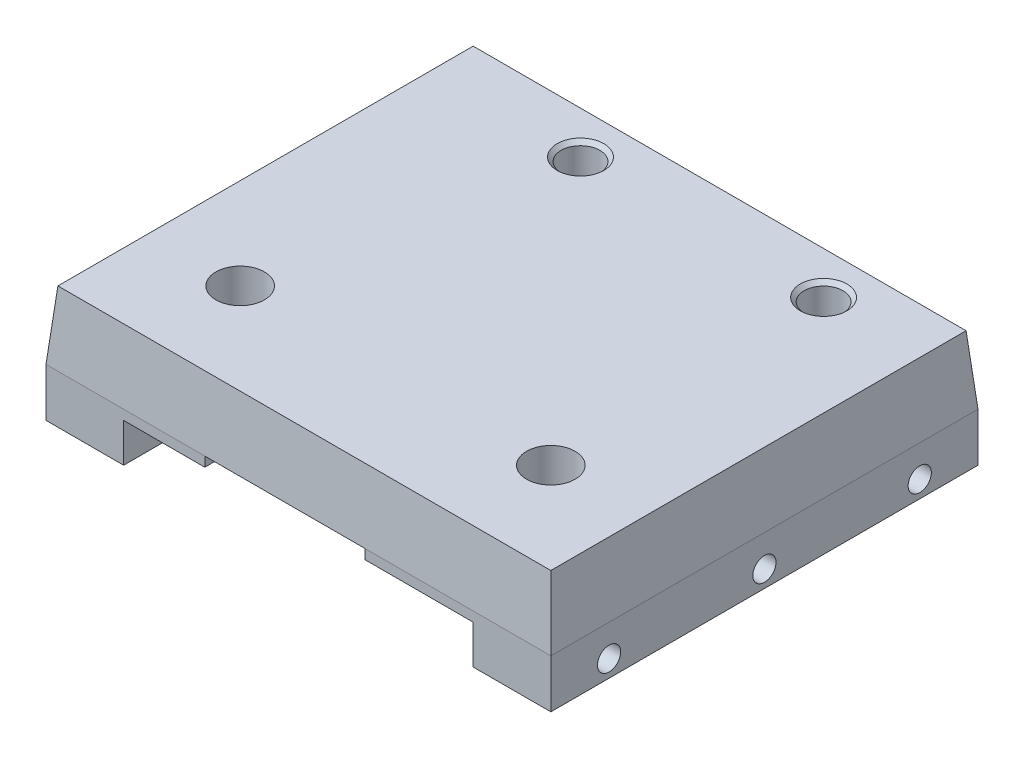
ISO-10303-21;
HEADER;
FILE_DESCRIPTION(('STEP AP214'),'2;1');
FILE_NAME('part.step','',(''),(''),'','','');
FILE_SCHEMA(('AUTOMOTIVE_DESIGN { 1 0 10303 214 1 1 1 1 }'));
ENDSEC;
DATA;
#1=APPLICATION_CONTEXT('core data for automotive mechanical design processes');
#2=APPLICATION_PROTOCOL_DEFINITION('international standard','automotive_design',2000,#1);
#3=PRODUCT_CONTEXT('',#1,'mechanical');
#4=PRODUCT('Part','Part','',(#3));
#5=PRODUCT_RELATED_PRODUCT_CATEGORY('part','',(#4));
#6=PRODUCT_DEFINITION_FORMATION('','',#4);
#7=PRODUCT_DEFINITION_CONTEXT('part definition',#1,'design');
#8=PRODUCT_DEFINITION('design','',#6,#7);
#9=PRODUCT_DEFINITION_SHAPE('','',#8);
#10=(LENGTH_UNIT() NAMED_UNIT(*) SI_UNIT(.MILLI.,.METRE.));
#11=(NAMED_UNIT(*) PLANE_ANGLE_UNIT() SI_UNIT($,.RADIAN.));
#12=(NAMED_UNIT(*) SI_UNIT($,.STERADIAN.) SOLID_ANGLE_UNIT());
#13=UNCERTAINTY_MEASURE_WITH_UNIT(LENGTH_MEASURE(1.E-05),#10,'distance_accuracy_value','');
#14=(GEOMETRIC_REPRESENTATION_CONTEXT(3) GLOBAL_UNCERTAINTY_ASSIGNED_CONTEXT((#13)) GLOBAL_UNIT_ASSIGNED_CONTEXT((#10,
#11,#12)) REPRESENTATION_CONTEXT('',''));
#15=CARTESIAN_POINT('',(0.,0.,0.));
#16=DIRECTION('',(0.,0.,1.));
#17=DIRECTION('',(1.,0.,0.));
#18=AXIS2_PLACEMENT_3D('',#15,#16,#17);
#19=CARTESIAN_POINT('',(0.,0.,0.));
#20=DIRECTION('',(0.,1.,0.));
#21=DIRECTION('',(0.,0.,1.));
#22=AXIS2_PLACEMENT_3D('',#19,#20,#21);
#23=PLANE('',#22);
#24=DIRECTION('',(0.,0.,-1.));
#25=VECTOR('',#24,1.);
#26=CARTESIAN_POINT('',(10.8908903883744,0.,34.925));
#27=LINE('',#26,#25);
#28=CARTESIAN_POINT('',(10.8908903883744,0.,34.925));
#29=VERTEX_POINT('',#28);
#30=CARTESIAN_POINT('',(10.8908903883744,0.,-34.925));
#31=VERTEX_POINT('',#30);
#32=EDGE_CURVE('E144',#29,#31,#27,.T.);
#33=ORIENTED_EDGE('',*,*,#32,.F.);
#34=DIRECTION('',(-1.,0.,0.));
#35=VECTOR('',#34,1.);
#36=CARTESIAN_POINT('',(0.,0.,34.925));
#37=LINE('',#36,#35);
#38=CARTESIAN_POINT('',(-15.3077386639732,0.,34.925));
#39=VERTEX_POINT('',#38);
#40=EDGE_CURVE('E100',#29,#39,#37,.T.);
#41=ORIENTED_EDGE('',*,*,#40,.T.);
#42=DIRECTION('',(0.,0.,1.));
#43=VECTOR('',#42,1.);
#44=CARTESIAN_POINT('',(-15.3077386639732,0.,34.925));
#45=LINE('',#44,#43);
#46=CARTESIAN_POINT('',(-15.3077386639732,0.,-34.925));
#47=VERTEX_POINT('',#46);
#48=EDGE_CURVE('E142',#47,#39,#45,.T.);
#49=ORIENTED_EDGE('',*,*,#48,.F.);
#50=DIRECTION('',(1.,0.,0.));
#51=VECTOR('',#50,1.);
#52=CARTESIAN_POINT('',(0.,0.,-34.925));
#53=LINE('',#52,#51);
#54=EDGE_CURVE('E124',#31,#47,#53,.F.);
#55=ORIENTED_EDGE('',*,*,#54,.F.);
#56=EDGE_LOOP('',(#33,#41,#49,#55));
#57=FACE_BOUND('',#56,.T.);
#58=ADVANCED_FACE('F39',(#57),#23,.F.);
#59=CARTESIAN_POINT('',(28.575,-7.9375,34.925));
#60=DIRECTION('',(1.,0.,0.));
#61=DIRECTION('',(0.,0.,-1.));
#62=AXIS2_PLACEMENT_3D('',#59,#60,#61);
#63=PLANE('',#62);
#64=CARTESIAN_POINT('',(28.575,-5.151627132439,25.4));
#65=DIRECTION('',(1.,0.,0.));
#66=DIRECTION('',(0.,0.,-1.));
#67=AXIS2_PLACEMENT_3D('',#64,#65,#66);
#68=CIRCLE('',#67,1.89864999999999);
#69=CARTESIAN_POINT('',(28.575,-5.151627132439,23.50135));
#70=VERTEX_POINT('',#69);
#71=EDGE_CURVE('E733',#70,#70,#68,.T.);
#72=ORIENTED_EDGE('',*,*,#71,.T.);
#73=EDGE_LOOP('',(#72));
#74=FACE_BOUND('',#73,.T.);
#75=CARTESIAN_POINT('',(28.575,-5.151627132439,-25.4));
#76=DIRECTION('',(1.,0.,0.));
#77=DIRECTION('',(0.,0.,-1.));
#78=AXIS2_PLACEMENT_3D('',#75,#76,#77);
#79=CIRCLE('',#78,1.89864999999999);
#80=CARTESIAN_POINT('',(28.575,-5.151627132439,-27.29865));
#81=VERTEX_POINT('',#80);
#82=EDGE_CURVE('E739',#81,#81,#79,.T.);
#83=ORIENTED_EDGE('',*,*,#82,.T.);
#84=EDGE_LOOP('',(#83));
#85=FACE_BOUND('',#84,.T.);
#86=CARTESIAN_POINT('',(28.575,-5.151627132439,0.));
#87=DIRECTION('',(1.,0.,0.));
#88=DIRECTION('',(0.,0.,-1.));
#89=AXIS2_PLACEMENT_3D('',#86,#87,#88);
#90=CIRCLE('',#89,1.89864999999999);
#91=CARTESIAN_POINT('',(28.575,-5.151627132439,-1.89865));
#92=VERTEX_POINT('',#91);
#93=EDGE_CURVE('E745',#92,#92,#90,.T.);
#94=ORIENTED_EDGE('',*,*,#93,.T.);
#95=EDGE_LOOP('',(#94));
#96=FACE_BOUND('',#95,.T.);
#97=DIRECTION('',(0.,0.,1.));
#98=VECTOR('',#97,1.);
#99=CARTESIAN_POINT('',(28.575,-1.5875,34.925));
#100=LINE('',#99,#98);
#101=CARTESIAN_POINT('',(28.575,-1.5875,-34.925));
#102=VERTEX_POINT('',#101);
#103=CARTESIAN_POINT('',(28.575,-1.5875,34.925));
#104=VERTEX_POINT('',#103);
#105=EDGE_CURVE('E748',#102,#104,#100,.T.);
#106=ORIENTED_EDGE('',*,*,#105,.F.);
#107=DIRECTION('',(0.,1.,0.));
#108=VECTOR('',#107,1.);
#109=CARTESIAN_POINT('',(28.575,-7.9375,-34.925));
#110=LINE('',#109,#108);
#111=CARTESIAN_POINT('',(28.575,-7.9375,-34.925));
#112=VERTEX_POINT('',#111);
#113=EDGE_CURVE('E194',#112,#102,#110,.T.);
#114=ORIENTED_EDGE('',*,*,#113,.F.);
#115=DIRECTION('',(0.,0.,-1.));
#116=VECTOR('',#115,1.);
#117=CARTESIAN_POINT('',(28.575,-7.9375,34.925));
#118=LINE('',#117,#116);
#119=CARTESIAN_POINT('',(28.575,-7.9375,34.925));
#120=VERTEX_POINT('',#119);
#121=EDGE_CURVE('E185',#120,#112,#118,.T.);
#122=ORIENTED_EDGE('',*,*,#121,.F.);
#123=DIRECTION('',(0.,1.,0.));
#124=VECTOR('',#123,1.);
#125=CARTESIAN_POINT('',(28.575,-7.9375,34.925));
#126=LINE('',#125,#124);
#127=EDGE_CURVE('E197',#120,#104,#126,.T.);
#128=ORIENTED_EDGE('',*,*,#127,.T.);
#129=EDGE_LOOP('',(#106,#114,#122,#128));
#130=FACE_BOUND('',#129,.T.);
#131=ADVANCED_FACE('F248',(#74,#85,#96,#130),#63,.F.);
#132=CARTESIAN_POINT('',(-41.275,0.,0.));
#133=DIRECTION('',(-0.996194698091746,0.0871557427476582,0.));
#134=DIRECTION('',(-0.0871557427476582,-0.996194698091746,0.));
#135=AXIS2_PLACEMENT_3D('',#132,#133,#134);
#136=PLANE('',#135);
#137=DIRECTION('',(0.,0.,-1.));
#138=VECTOR('',#137,1.);
#139=CARTESIAN_POINT('',(-41.275,0.,0.));
#140=LINE('',#139,#138);
#141=CARTESIAN_POINT('',(-41.275,0.,34.925));
#142=VERTEX_POINT('',#141);
#143=CARTESIAN_POINT('',(-41.275,0.,-34.925));
#144=VERTEX_POINT('',#143);
#145=EDGE_CURVE('E97',#142,#144,#140,.T.);
#146=ORIENTED_EDGE('',*,*,#145,.F.);
#147=DIRECTION('',(-0.0868265938642476,-0.992432509138967,0.0868265938642477));
#148=VECTOR('',#147,1.);
#149=CARTESIAN_POINT('',(-40.9638336607297,3.55664753271849,34.6138336607297));
#150=LINE('',#149,#148);
#151=CARTESIAN_POINT('',(-40.3027822265682,11.1125,33.9527822265682));
#152=VERTEX_POINT('',#151);
#153=EDGE_CURVE('E11',#152,#142,#150,.T.);
#154=ORIENTED_EDGE('',*,*,#153,.F.);
#155=DIRECTION('',(0.,0.,1.));
#156=VECTOR('',#155,1.);
#157=CARTESIAN_POINT('',(-40.3027822265682,11.1125,0.));
#158=LINE('',#157,#156);
#159=CARTESIAN_POINT('',(-40.3027822265682,11.1125,-33.9527822265682));
#160=VERTEX_POINT('',#159);
#161=EDGE_CURVE('E104',#160,#152,#158,.T.);
#162=ORIENTED_EDGE('',*,*,#161,.F.);
#163=DIRECTION('',(0.0868265938642476,0.992432509138967,0.0868265938642476));
#164=VECTOR('',#163,1.);
#165=CARTESIAN_POINT('',(-40.9638336607297,3.55664753271849,-34.6138336607297));
#166=LINE('',#165,#164);
#167=EDGE_CURVE('E87',#160,#144,#166,.F.);
#168=ORIENTED_EDGE('',*,*,#167,.T.);
#169=EDGE_LOOP('',(#146,#154,#162,#168));
#170=FACE_BOUND('',#169,.T.);
#171=ADVANCED_FACE('F252',(#170),#136,.T.);
#172=CARTESIAN_POINT('',(0.,0.,34.925));
#173=DIRECTION('',(0.,0.0871557427476582,0.996194698091746));
#174=DIRECTION('',(0.,-0.996194698091746,0.0871557427476582));
#175=AXIS2_PLACEMENT_3D('',#172,#173,#174);
#176=PLANE('',#175);
#177=CARTESIAN_POINT('',(41.275,0.,34.925));
#178=VERTEX_POINT('',#177);
#179=EDGE_CURVE('E125',#178,#29,#37,.T.);
#180=ORIENTED_EDGE('',*,*,#179,.F.);
#181=DIRECTION('',(-0.0868265938642476,0.992432509138967,-0.0868265938642476));
#182=VECTOR('',#181,1.);
#183=CARTESIAN_POINT('',(40.9638336607297,3.55664753271849,34.6138336607297));
#184=LINE('',#183,#182);
#185=CARTESIAN_POINT('',(40.3027822265682,11.1125,33.9527822265682));
#186=VERTEX_POINT('',#185);
#187=EDGE_CURVE('E49',#186,#178,#184,.F.);
#188=ORIENTED_EDGE('',*,*,#187,.F.);
#189=DIRECTION('',(1.,0.,0.));
#190=VECTOR('',#189,1.);
#191=CARTESIAN_POINT('',(0.,11.1125,33.9527822265682));
#192=LINE('',#191,#190);
#193=EDGE_CURVE('E95',#152,#186,#192,.T.);
#194=ORIENTED_EDGE('',*,*,#193,.F.);
#195=ORIENTED_EDGE('',*,*,#153,.T.);
#196=DIRECTION('',(-1.,0.,0.));
#197=VECTOR('',#196,1.);
#198=CARTESIAN_POINT('',(-41.275,0.,34.925));
#199=LINE('',#198,#197);
#200=EDGE_CURVE('E148',#39,#142,#199,.T.);
#201=ORIENTED_EDGE('',*,*,#200,.F.);
#202=ORIENTED_EDGE('',*,*,#40,.F.);
#203=EDGE_LOOP('',(#180,#188,#194,#195,#201,#202));
#204=FACE_BOUND('',#203,.T.);
#205=ADVANCED_FACE('F149',(#204),#176,.T.);
#206=CARTESIAN_POINT('',(41.275,0.,0.));
#207=DIRECTION('',(0.996194698091746,0.0871557427476582,0.));
#208=DIRECTION('',(-0.0871557427476582,0.996194698091746,0.));
#209=AXIS2_PLACEMENT_3D('',#206,#207,#208);
#210=PLANE('',#209);
#211=DIRECTION('',(0.,0.,1.));
#212=VECTOR('',#211,1.);
#213=CARTESIAN_POINT('',(41.275,0.,0.));
#214=LINE('',#213,#212);
#215=CARTESIAN_POINT('',(41.275,0.,-34.925));
#216=VERTEX_POINT('',#215);
#217=EDGE_CURVE('E84',#178,#216,#214,.F.);
#218=ORIENTED_EDGE('',*,*,#217,.T.);
#219=DIRECTION('',(0.0868265938642476,-0.992432509138967,-0.0868265938642477));
#220=VECTOR('',#219,1.);
#221=CARTESIAN_POINT('',(40.9638336607297,3.55664753271849,-34.6138336607297));
#222=LINE('',#221,#220);
#223=CARTESIAN_POINT('',(40.3027822265682,11.1125,-33.9527822265682));
#224=VERTEX_POINT('',#223);
#225=EDGE_CURVE('E80',#224,#216,#222,.T.);
#226=ORIENTED_EDGE('',*,*,#225,.F.);
#227=DIRECTION('',(0.,0.,1.));
#228=VECTOR('',#227,1.);
#229=CARTESIAN_POINT('',(40.3027822265682,11.1125,0.));
#230=LINE('',#229,#228);
#231=EDGE_CURVE('E43',#186,#224,#230,.F.);
#232=ORIENTED_EDGE('',*,*,#231,.F.);
#233=ORIENTED_EDGE('',*,*,#187,.T.);
#234=EDGE_LOOP('',(#218,#226,#232,#233));
#235=FACE_BOUND('',#234,.T.);
#236=ADVANCED_FACE('F41',(#235),#210,.T.);
#237=CARTESIAN_POINT('',(0.,0.,-34.925));
#238=DIRECTION('',(0.,0.0871557427476582,-0.996194698091746));
#239=DIRECTION('',(0.,0.996194698091746,0.0871557427476582));
#240=AXIS2_PLACEMENT_3D('',#237,#238,#239);
#241=PLANE('',#240);
#242=EDGE_CURVE('E120',#216,#31,#53,.F.);
#243=ORIENTED_EDGE('',*,*,#242,.T.);
#244=ORIENTED_EDGE('',*,*,#54,.T.);
#245=DIRECTION('',(1.,0.,0.));
#246=VECTOR('',#245,1.);
#247=CARTESIAN_POINT('',(-41.275,0.,-34.925));
#248=LINE('',#247,#246);
#249=EDGE_CURVE('E58',#144,#47,#248,.T.);
#250=ORIENTED_EDGE('',*,*,#249,.F.);
#251=ORIENTED_EDGE('',*,*,#167,.F.);
#252=DIRECTION('',(1.,0.,0.));
#253=VECTOR('',#252,1.);
#254=CARTESIAN_POINT('',(0.,11.1125,-33.9527822265682));
#255=LINE('',#254,#253);
#256=EDGE_CURVE('E93',#224,#160,#255,.F.);
#257=ORIENTED_EDGE('',*,*,#256,.F.);
#258=ORIENTED_EDGE('',*,*,#225,.T.);
#259=EDGE_LOOP('',(#243,#244,#250,#251,#257,#258));
#260=FACE_BOUND('',#259,.T.);
#261=ADVANCED_FACE('F96',(#260),#241,.T.);
#262=CARTESIAN_POINT('',(0.,11.1125,0.));
#263=DIRECTION('',(0.,-1.,0.));
#264=DIRECTION('',(0.,0.,-1.));
#265=AXIS2_PLACEMENT_3D('',#262,#263,#264);
#266=PLANE('',#265);
#267=CARTESIAN_POINT('',(-15.8177036850335,11.1125,-27.0183903920811));
#268=DIRECTION('',(0.,1.,0.));
#269=DIRECTION('',(0.,0.,1.));
#270=AXIS2_PLACEMENT_3D('',#267,#268,#269);
#271=CIRCLE('',#270,3.81);
#272=CARTESIAN_POINT('',(-15.8177036850335,11.1125,-23.2083903920811));
#273=VERTEX_POINT('',#272);
#274=EDGE_CURVE('E721',#273,#273,#271,.T.);
#275=ORIENTED_EDGE('',*,*,#274,.F.);
#276=EDGE_LOOP('',(#275));
#277=FACE_BOUND('',#276,.T.);
#278=CARTESIAN_POINT('',(23.9310882670804,11.1125,-27.0183903920814));
#279=DIRECTION('',(0.,1.,0.));
#280=DIRECTION('',(0.,0.,1.));
#281=AXIS2_PLACEMENT_3D('',#278,#279,#280);
#282=CIRCLE('',#281,3.81);
#283=CARTESIAN_POINT('',(23.9310882670804,11.1125,-23.2083903920814));
#284=VERTEX_POINT('',#283);
#285=EDGE_CURVE('E714',#284,#284,#282,.T.);
#286=ORIENTED_EDGE('',*,*,#285,.F.);
#287=EDGE_LOOP('',(#286));
#288=FACE_BOUND('',#287,.T.);
#289=CARTESIAN_POINT('',(-25.4,11.1125,19.05));
#290=DIRECTION('',(0.,1.,0.));
#291=DIRECTION('',(0.,0.,1.));
#292=AXIS2_PLACEMENT_3D('',#289,#290,#291);
#293=CIRCLE('',#292,3.96874999999999);
#294=CARTESIAN_POINT('',(-25.4,11.1125,23.01875));
#295=VERTEX_POINT('',#294);
#296=EDGE_CURVE('E224',#295,#295,#293,.T.);
#297=ORIENTED_EDGE('',*,*,#296,.F.);
#298=EDGE_LOOP('',(#297));
#299=FACE_BOUND('',#298,.T.);
#300=CARTESIAN_POINT('',(25.4,11.1125,19.05));
#301=DIRECTION('',(0.,1.,0.));
#302=DIRECTION('',(0.,0.,1.));
#303=AXIS2_PLACEMENT_3D('',#300,#301,#302);
#304=CIRCLE('',#303,3.96874999999999);
#305=CARTESIAN_POINT('',(25.4,11.1125,23.01875));
#306=VERTEX_POINT('',#305);
#307=EDGE_CURVE('E112',#306,#306,#304,.T.);
#308=ORIENTED_EDGE('',*,*,#307,.F.);
#309=EDGE_LOOP('',(#308));
#310=FACE_BOUND('',#309,.T.);
#311=ORIENTED_EDGE('',*,*,#161,.T.);
#312=ORIENTED_EDGE('',*,*,#193,.T.);
#313=ORIENTED_EDGE('',*,*,#231,.T.);
#314=ORIENTED_EDGE('',*,*,#256,.T.);
#315=EDGE_LOOP('',(#311,#312,#313,#314));
#316=FACE_BOUND('',#315,.T.);
#317=ADVANCED_FACE('F92',(#277,#288,#299,#310,#316),#266,.F.);
#318=CARTESIAN_POINT('',(25.4,1.5875,19.05));
#319=DIRECTION('',(0.,1.,0.));
#320=DIRECTION('',(0.,0.,1.));
#321=AXIS2_PLACEMENT_3D('',#318,#319,#320);
#322=CONICAL_SURFACE('',#321,3.96875,1.02974425867665);
#323=CARTESIAN_POINT('',(25.4,1.5875,19.05));
#324=DIRECTION('',(0.,1.,0.));
#325=DIRECTION('',(0.,0.,1.));
#326=AXIS2_PLACEMENT_3D('',#323,#324,#325);
#327=CIRCLE('',#326,3.96875);
#328=CARTESIAN_POINT('',(25.4,1.5875,23.01875));
#329=VERTEX_POINT('',#328);
#330=EDGE_CURVE('E107',#329,#329,#327,.T.);
#331=ORIENTED_EDGE('',*,*,#330,.T.);
#332=EDGE_LOOP('',(#331));
#333=FACE_BOUND('',#332,.T.);
#334=CARTESIAN_POINT('',(25.4,0.,19.05));
#335=DIRECTION('',(0.,1.,0.));
#336=DIRECTION('',(0.,0.,1.));
#337=AXIS2_PLACEMENT_3D('',#334,#335,#336);
#338=CIRCLE('',#337,1.32670632176855);
#339=CARTESIAN_POINT('',(25.4,0.,20.3767063217686));
#340=VERTEX_POINT('',#339);
#341=EDGE_CURVE('E105',#340,#340,#338,.T.);
#342=ORIENTED_EDGE('',*,*,#341,.F.);
#343=EDGE_LOOP('',(#342));
#344=FACE_BOUND('',#343,.T.);
#345=ADVANCED_FACE('F234',(#333,#344),#322,.F.);
#346=CARTESIAN_POINT('',(25.4,11.1125,19.05));
#347=DIRECTION('',(0.,1.,0.));
#348=DIRECTION('',(0.,0.,1.));
#349=AXIS2_PLACEMENT_3D('',#346,#347,#348);
#350=CYLINDRICAL_SURFACE('',#349,3.96874999999999);
#351=ORIENTED_EDGE('',*,*,#330,.F.);
#352=EDGE_LOOP('',(#351));
#353=FACE_BOUND('',#352,.T.);
#354=ORIENTED_EDGE('',*,*,#307,.T.);
#355=EDGE_LOOP('',(#354));
#356=FACE_BOUND('',#355,.T.);
#357=ADVANCED_FACE('F231',(#353,#356),#350,.F.);
#358=CARTESIAN_POINT('',(-25.4,1.5875,19.05));
#359=DIRECTION('',(0.,1.,0.));
#360=DIRECTION('',(0.,0.,1.));
#361=AXIS2_PLACEMENT_3D('',#358,#359,#360);
#362=CONICAL_SURFACE('',#361,3.96875,1.02974425867665);
#363=CARTESIAN_POINT('',(-25.4,1.5875,19.05));
#364=DIRECTION('',(0.,1.,0.));
#365=DIRECTION('',(0.,0.,1.));
#366=AXIS2_PLACEMENT_3D('',#363,#364,#365);
#367=CIRCLE('',#366,3.96875);
#368=CARTESIAN_POINT('',(-25.4,1.5875,23.01875));
#369=VERTEX_POINT('',#368);
#370=EDGE_CURVE('E119',#369,#369,#367,.T.);
#371=ORIENTED_EDGE('',*,*,#370,.T.);
#372=EDGE_LOOP('',(#371));
#373=FACE_BOUND('',#372,.T.);
#374=CARTESIAN_POINT('',(-25.4,0.,19.05));
#375=DIRECTION('',(0.,1.,0.));
#376=DIRECTION('',(0.,0.,1.));
#377=AXIS2_PLACEMENT_3D('',#374,#375,#376);
#378=CIRCLE('',#377,1.32670632176855);
#379=CARTESIAN_POINT('',(-25.4,0.,20.3767063217686));
#380=VERTEX_POINT('',#379);
#381=EDGE_CURVE('E116',#380,#380,#378,.T.);
#382=ORIENTED_EDGE('',*,*,#381,.F.);
#383=EDGE_LOOP('',(#382));
#384=FACE_BOUND('',#383,.T.);
#385=ADVANCED_FACE('F528',(#373,#384),#362,.F.);
#386=CARTESIAN_POINT('',(-25.4,11.1125,19.05));
#387=DIRECTION('',(0.,1.,0.));
#388=DIRECTION('',(0.,0.,1.));
#389=AXIS2_PLACEMENT_3D('',#386,#387,#388);
#390=CYLINDRICAL_SURFACE('',#389,3.96874999999999);
#391=ORIENTED_EDGE('',*,*,#370,.F.);
#392=EDGE_LOOP('',(#391));
#393=FACE_BOUND('',#392,.T.);
#394=ORIENTED_EDGE('',*,*,#296,.T.);
#395=EDGE_LOOP('',(#394));
#396=FACE_BOUND('',#395,.T.);
#397=ADVANCED_FACE('F524',(#393,#396),#390,.F.);
#398=CARTESIAN_POINT('',(-41.275,-7.9375,-34.925));
#399=DIRECTION('',(1.,0.,0.));
#400=DIRECTION('',(0.,0.,-1.));
#401=AXIS2_PLACEMENT_3D('',#398,#399,#400);
#402=PLANE('',#401);
#403=ORIENTED_EDGE('',*,*,#145,.T.);
#404=DIRECTION('',(0.,1.,0.));
#405=VECTOR('',#404,1.);
#406=CARTESIAN_POINT('',(-41.275,-7.9375,-34.925));
#407=LINE('',#406,#405);
#408=CARTESIAN_POINT('',(-41.275,-7.9375,-34.925));
#409=VERTEX_POINT('',#408);
#410=EDGE_CURVE('E221',#409,#144,#407,.T.);
#411=ORIENTED_EDGE('',*,*,#410,.F.);
#412=DIRECTION('',(0.,0.,-1.));
#413=VECTOR('',#412,1.);
#414=CARTESIAN_POINT('',(-41.275,-7.9375,-34.925));
#415=LINE('',#414,#413);
#416=CARTESIAN_POINT('',(-41.275,-7.9375,34.925));
#417=VERTEX_POINT('',#416);
#418=EDGE_CURVE('E155',#417,#409,#415,.T.);
#419=ORIENTED_EDGE('',*,*,#418,.F.);
#420=DIRECTION('',(0.,1.,0.));
#421=VECTOR('',#420,1.);
#422=CARTESIAN_POINT('',(-41.275,-7.9375,34.925));
#423=LINE('',#422,#421);
#424=EDGE_CURVE('E213',#417,#142,#423,.T.);
#425=ORIENTED_EDGE('',*,*,#424,.T.);
#426=EDGE_LOOP('',(#403,#411,#419,#425));
#427=FACE_BOUND('',#426,.T.);
#428=ADVANCED_FACE('F286',(#427),#402,.F.);
#429=CARTESIAN_POINT('',(-41.275,-7.9375,-34.925));
#430=DIRECTION('',(0.,0.,1.));
#431=DIRECTION('',(1.,0.,0.));
#432=AXIS2_PLACEMENT_3D('',#429,#430,#431);
#433=PLANE('',#432);
#434=ORIENTED_EDGE('',*,*,#249,.T.);
#435=DIRECTION('',(0.,1.,0.));
#436=VECTOR('',#435,1.);
#437=CARTESIAN_POINT('',(-15.3077386639732,-1.5875,-34.925));
#438=LINE('',#437,#436);
#439=CARTESIAN_POINT('',(-15.3077386639732,-1.5875,-34.925));
#440=VERTEX_POINT('',#439);
#441=EDGE_CURVE('E166',#440,#47,#438,.T.);
#442=ORIENTED_EDGE('',*,*,#441,.F.);
#443=DIRECTION('',(1.,0.,0.));
#444=VECTOR('',#443,1.);
#445=CARTESIAN_POINT('',(-28.575,-1.5875,-34.925));
#446=LINE('',#445,#444);
#447=CARTESIAN_POINT('',(-28.575,-1.5875,-34.925));
#448=VERTEX_POINT('',#447);
#449=EDGE_CURVE('E764',#448,#440,#446,.T.);
#450=ORIENTED_EDGE('',*,*,#449,.F.);
#451=DIRECTION('',(0.,1.,0.));
#452=VECTOR('',#451,1.);
#453=CARTESIAN_POINT('',(-28.575,-7.9375,-34.925));
#454=LINE('',#453,#452);
#455=CARTESIAN_POINT('',(-28.575,-7.9375,-34.925));
#456=VERTEX_POINT('',#455);
#457=EDGE_CURVE('E218',#456,#448,#454,.T.);
#458=ORIENTED_EDGE('',*,*,#457,.F.);
#459=DIRECTION('',(1.,0.,0.));
#460=VECTOR('',#459,1.);
#461=CARTESIAN_POINT('',(-41.275,-7.9375,-34.925));
#462=LINE('',#461,#460);
#463=EDGE_CURVE('E204',#409,#456,#462,.T.);
#464=ORIENTED_EDGE('',*,*,#463,.F.);
#465=ORIENTED_EDGE('',*,*,#410,.T.);
#466=EDGE_LOOP('',(#434,#442,#450,#458,#464,#465));
#467=FACE_BOUND('',#466,.T.);
#468=ADVANCED_FACE('F280',(#467),#433,.F.);
#469=CARTESIAN_POINT('',(-28.575,-7.9375,-34.925));
#470=DIRECTION('',(-1.,0.,0.));
#471=DIRECTION('',(0.,0.,1.));
#472=AXIS2_PLACEMENT_3D('',#469,#470,#471);
#473=PLANE('',#472);
#474=ORIENTED_EDGE('',*,*,#457,.T.);
#475=DIRECTION('',(0.,0.,-1.));
#476=VECTOR('',#475,1.);
#477=CARTESIAN_POINT('',(-28.575,-1.5875,34.925));
#478=LINE('',#477,#476);
#479=CARTESIAN_POINT('',(-28.575,-1.5875,34.925));
#480=VERTEX_POINT('',#479);
#481=EDGE_CURVE('E167',#480,#448,#478,.T.);
#482=ORIENTED_EDGE('',*,*,#481,.F.);
#483=DIRECTION('',(0.,1.,0.));
#484=VECTOR('',#483,1.);
#485=CARTESIAN_POINT('',(-28.575,-7.9375,34.925));
#486=LINE('',#485,#484);
#487=CARTESIAN_POINT('',(-28.575,-7.9375,34.925));
#488=VERTEX_POINT('',#487);
#489=EDGE_CURVE('E216',#488,#480,#486,.T.);
#490=ORIENTED_EDGE('',*,*,#489,.F.);
#491=DIRECTION('',(0.,0.,1.));
#492=VECTOR('',#491,1.);
#493=CARTESIAN_POINT('',(-28.575,-7.9375,-34.925));
#494=LINE('',#493,#492);
#495=EDGE_CURVE('E207',#456,#488,#494,.T.);
#496=ORIENTED_EDGE('',*,*,#495,.F.);
#497=EDGE_LOOP('',(#474,#482,#490,#496));
#498=FACE_BOUND('',#497,.T.);
#499=ADVANCED_FACE('F285',(#498),#473,.F.);
#500=CARTESIAN_POINT('',(-41.275,-7.9375,34.925));
#501=DIRECTION('',(0.,0.,-1.));
#502=DIRECTION('',(-1.,0.,0.));
#503=AXIS2_PLACEMENT_3D('',#500,#501,#502);
#504=PLANE('',#503);
#505=ORIENTED_EDGE('',*,*,#200,.T.);
#506=ORIENTED_EDGE('',*,*,#424,.F.);
#507=DIRECTION('',(-1.,0.,0.));
#508=VECTOR('',#507,1.);
#509=CARTESIAN_POINT('',(-41.275,-7.9375,34.925));
#510=LINE('',#509,#508);
#511=EDGE_CURVE('E210',#488,#417,#510,.T.);
#512=ORIENTED_EDGE('',*,*,#511,.F.);
#513=ORIENTED_EDGE('',*,*,#489,.T.);
#514=DIRECTION('',(-1.,0.,0.));
#515=VECTOR('',#514,1.);
#516=CARTESIAN_POINT('',(-28.575,-1.5875,34.925));
#517=LINE('',#516,#515);
#518=CARTESIAN_POINT('',(-15.3077386639732,-1.5875,34.925));
#519=VERTEX_POINT('',#518);
#520=EDGE_CURVE('E173',#519,#480,#517,.T.);
#521=ORIENTED_EDGE('',*,*,#520,.F.);
#522=DIRECTION('',(0.,1.,0.));
#523=VECTOR('',#522,1.);
#524=CARTESIAN_POINT('',(-15.3077386639732,-1.5875,34.925));
#525=LINE('',#524,#523);
#526=EDGE_CURVE('E163',#519,#39,#525,.T.);
#527=ORIENTED_EDGE('',*,*,#526,.T.);
#528=EDGE_LOOP('',(#505,#506,#512,#513,#521,#527));
#529=FACE_BOUND('',#528,.T.);
#530=ADVANCED_FACE('F170',(#529),#504,.F.);
#531=CARTESIAN_POINT('',(0.,-7.9375,0.));
#532=DIRECTION('',(0.,1.,0.));
#533=DIRECTION('',(0.,0.,1.));
#534=AXIS2_PLACEMENT_3D('',#531,#532,#533);
#535=PLANE('',#534);
#536=ORIENTED_EDGE('',*,*,#418,.T.);
#537=ORIENTED_EDGE('',*,*,#463,.T.);
#538=ORIENTED_EDGE('',*,*,#495,.T.);
#539=ORIENTED_EDGE('',*,*,#511,.T.);
#540=EDGE_LOOP('',(#536,#537,#538,#539));
#541=FACE_BOUND('',#540,.T.);
#542=ADVANCED_FACE('F309',(#541),#535,.F.);
#543=CARTESIAN_POINT('',(41.275,-7.9375,34.925));
#544=DIRECTION('',(-1.,0.,0.));
#545=DIRECTION('',(0.,0.,1.));
#546=AXIS2_PLACEMENT_3D('',#543,#544,#545);
#547=PLANE('',#546);
#548=CARTESIAN_POINT('',(41.275,-5.151627132439,25.4));
#549=DIRECTION('',(1.,0.,0.));
#550=DIRECTION('',(0.,0.,-1.));
#551=AXIS2_PLACEMENT_3D('',#548,#549,#550);
#552=CIRCLE('',#551,1.89864999999999);
#553=CARTESIAN_POINT('',(41.275,-5.151627132439,23.50135));
#554=VERTEX_POINT('',#553);
#555=EDGE_CURVE('E730',#554,#554,#552,.T.);
#556=ORIENTED_EDGE('',*,*,#555,.F.);
#557=EDGE_LOOP('',(#556));
#558=FACE_BOUND('',#557,.T.);
#559=CARTESIAN_POINT('',(41.275,-5.151627132439,-25.4));
#560=DIRECTION('',(1.,0.,0.));
#561=DIRECTION('',(0.,0.,-1.));
#562=AXIS2_PLACEMENT_3D('',#559,#560,#561);
#563=CIRCLE('',#562,1.89864999999999);
#564=CARTESIAN_POINT('',(41.275,-5.151627132439,-27.29865));
#565=VERTEX_POINT('',#564);
#566=EDGE_CURVE('E736',#565,#565,#563,.T.);
#567=ORIENTED_EDGE('',*,*,#566,.F.);
#568=EDGE_LOOP('',(#567));
#569=FACE_BOUND('',#568,.T.);
#570=CARTESIAN_POINT('',(41.275,-5.151627132439,0.));
#571=DIRECTION('',(1.,0.,0.));
#572=DIRECTION('',(0.,0.,-1.));
#573=AXIS2_PLACEMENT_3D('',#570,#571,#572);
#574=CIRCLE('',#573,1.89864999999999);
#575=CARTESIAN_POINT('',(41.275,-5.151627132439,-1.89864999999999));
#576=VERTEX_POINT('',#575);
#577=EDGE_CURVE('E742',#576,#576,#574,.T.);
#578=ORIENTED_EDGE('',*,*,#577,.F.);
#579=EDGE_LOOP('',(#578));
#580=FACE_BOUND('',#579,.T.);
#581=ORIENTED_EDGE('',*,*,#217,.F.);
#582=DIRECTION('',(0.,1.,0.));
#583=VECTOR('',#582,1.);
#584=CARTESIAN_POINT('',(41.275,-7.9375,34.925));
#585=LINE('',#584,#583);
#586=CARTESIAN_POINT('',(41.275,-7.9375,34.925));
#587=VERTEX_POINT('',#586);
#588=EDGE_CURVE('E200',#587,#178,#585,.T.);
#589=ORIENTED_EDGE('',*,*,#588,.F.);
#590=DIRECTION('',(0.,0.,1.));
#591=VECTOR('',#590,1.);
#592=CARTESIAN_POINT('',(41.275,-7.9375,34.925));
#593=LINE('',#592,#591);
#594=CARTESIAN_POINT('',(41.275,-7.9375,-34.925));
#595=VERTEX_POINT('',#594);
#596=EDGE_CURVE('E175',#595,#587,#593,.T.);
#597=ORIENTED_EDGE('',*,*,#596,.F.);
#598=DIRECTION('',(0.,1.,0.));
#599=VECTOR('',#598,1.);
#600=CARTESIAN_POINT('',(41.275,-7.9375,-34.925));
#601=LINE('',#600,#599);
#602=EDGE_CURVE('E191',#595,#216,#601,.T.);
#603=ORIENTED_EDGE('',*,*,#602,.T.);
#604=EDGE_LOOP('',(#581,#589,#597,#603));
#605=FACE_BOUND('',#604,.T.);
#606=ADVANCED_FACE('F321',(#558,#569,#580,#605),#547,.F.);
#607=CARTESIAN_POINT('',(41.275,-7.9375,34.925));
#608=DIRECTION('',(0.,0.,-1.));
#609=DIRECTION('',(-1.,0.,0.));
#610=AXIS2_PLACEMENT_3D('',#607,#608,#609);
#611=PLANE('',#610);
#612=ORIENTED_EDGE('',*,*,#179,.T.);
#613=DIRECTION('',(0.,1.,0.));
#614=VECTOR('',#613,1.);
#615=CARTESIAN_POINT('',(10.8908903883744,-1.5875,34.925));
#616=LINE('',#615,#614);
#617=CARTESIAN_POINT('',(10.8908903883744,-1.5875,34.925));
#618=VERTEX_POINT('',#617);
#619=EDGE_CURVE('E168',#618,#29,#616,.T.);
#620=ORIENTED_EDGE('',*,*,#619,.F.);
#621=DIRECTION('',(-1.,0.,0.));
#622=VECTOR('',#621,1.);
#623=CARTESIAN_POINT('',(28.575,-1.5875,34.925));
#624=LINE('',#623,#622);
#625=EDGE_CURVE('E751',#104,#618,#624,.T.);
#626=ORIENTED_EDGE('',*,*,#625,.F.);
#627=ORIENTED_EDGE('',*,*,#127,.F.);
#628=DIRECTION('',(-1.,0.,0.));
#629=VECTOR('',#628,1.);
#630=CARTESIAN_POINT('',(41.275,-7.9375,34.925));
#631=LINE('',#630,#629);
#632=EDGE_CURVE('E182',#587,#120,#631,.T.);
#633=ORIENTED_EDGE('',*,*,#632,.F.);
#634=ORIENTED_EDGE('',*,*,#588,.T.);
#635=EDGE_LOOP('',(#612,#620,#626,#627,#633,#634));
#636=FACE_BOUND('',#635,.T.);
#637=ADVANCED_FACE('F316',(#636),#611,.F.);
#638=CARTESIAN_POINT('',(41.275,-7.9375,-34.925));
#639=DIRECTION('',(0.,0.,1.));
#640=DIRECTION('',(1.,0.,0.));
#641=AXIS2_PLACEMENT_3D('',#638,#639,#640);
#642=PLANE('',#641);
#643=ORIENTED_EDGE('',*,*,#242,.F.);
#644=ORIENTED_EDGE('',*,*,#602,.F.);
#645=DIRECTION('',(1.,0.,0.));
#646=VECTOR('',#645,1.);
#647=CARTESIAN_POINT('',(41.275,-7.9375,-34.925));
#648=LINE('',#647,#646);
#649=EDGE_CURVE('E188',#112,#595,#648,.T.);
#650=ORIENTED_EDGE('',*,*,#649,.F.);
#651=ORIENTED_EDGE('',*,*,#113,.T.);
#652=DIRECTION('',(1.,0.,0.));
#653=VECTOR('',#652,1.);
#654=CARTESIAN_POINT('',(28.575,-1.5875,-34.925));
#655=LINE('',#654,#653);
#656=CARTESIAN_POINT('',(10.8908903883744,-1.5875,-34.925));
#657=VERTEX_POINT('',#656);
#658=EDGE_CURVE('E755',#657,#102,#655,.T.);
#659=ORIENTED_EDGE('',*,*,#658,.F.);
#660=DIRECTION('',(0.,1.,0.));
#661=VECTOR('',#660,1.);
#662=CARTESIAN_POINT('',(10.8908903883744,-1.5875,-34.925));
#663=LINE('',#662,#661);
#664=EDGE_CURVE('E757',#657,#31,#663,.T.);
#665=ORIENTED_EDGE('',*,*,#664,.T.);
#666=EDGE_LOOP('',(#643,#644,#650,#651,#659,#665));
#667=FACE_BOUND('',#666,.T.);
#668=ADVANCED_FACE('F320',(#667),#642,.F.);
#669=CARTESIAN_POINT('',(0.,-7.9375,0.));
#670=DIRECTION('',(0.,1.,0.));
#671=DIRECTION('',(0.,0.,1.));
#672=AXIS2_PLACEMENT_3D('',#669,#670,#671);
#673=PLANE('',#672);
#674=ORIENTED_EDGE('',*,*,#596,.T.);
#675=ORIENTED_EDGE('',*,*,#632,.T.);
#676=ORIENTED_EDGE('',*,*,#121,.T.);
#677=ORIENTED_EDGE('',*,*,#649,.T.);
#678=EDGE_LOOP('',(#674,#675,#676,#677));
#679=FACE_BOUND('',#678,.T.);
#680=ADVANCED_FACE('F332',(#679),#673,.F.);
#681=CARTESIAN_POINT('',(0.,-1.5875,0.));
#682=DIRECTION('',(0.,-1.,0.));
#683=DIRECTION('',(0.,0.,-1.));
#684=AXIS2_PLACEMENT_3D('',#681,#682,#683);
#685=PLANE('',#684);
#686=ORIENTED_EDGE('',*,*,#481,.T.);
#687=ORIENTED_EDGE('',*,*,#449,.T.);
#688=DIRECTION('',(0.,0.,1.));
#689=VECTOR('',#688,1.);
#690=CARTESIAN_POINT('',(-15.3077386639732,-1.5875,34.925));
#691=LINE('',#690,#689);
#692=EDGE_CURVE('E177',#440,#519,#691,.T.);
#693=ORIENTED_EDGE('',*,*,#692,.T.);
#694=ORIENTED_EDGE('',*,*,#520,.T.);
#695=EDGE_LOOP('',(#686,#687,#693,#694));
#696=FACE_BOUND('',#695,.T.);
#697=ADVANCED_FACE('F341',(#696),#685,.T.);
#698=CARTESIAN_POINT('',(-15.3077386639732,-1.5875,34.925));
#699=DIRECTION('',(-1.,0.,0.));
#700=DIRECTION('',(0.,0.,1.));
#701=AXIS2_PLACEMENT_3D('',#698,#699,#700);
#702=PLANE('',#701);
#703=ORIENTED_EDGE('',*,*,#48,.T.);
#704=ORIENTED_EDGE('',*,*,#526,.F.);
#705=ORIENTED_EDGE('',*,*,#692,.F.);
#706=ORIENTED_EDGE('',*,*,#441,.T.);
#707=EDGE_LOOP('',(#703,#704,#705,#706));
#708=FACE_BOUND('',#707,.T.);
#709=ADVANCED_FACE('F160',(#708),#702,.F.);
#710=CARTESIAN_POINT('',(0.,0.,0.));
#711=DIRECTION('',(0.,-1.,0.));
#712=DIRECTION('',(0.,0.,-1.));
#713=AXIS2_PLACEMENT_3D('',#710,#711,#712);
#714=PLANE('',#713);
#715=ORIENTED_EDGE('',*,*,#381,.T.);
#716=EDGE_LOOP('',(#715));
#717=FACE_BOUND('',#716,.T.);
#718=ADVANCED_FACE('F354',(#717),#714,.F.);
#719=CARTESIAN_POINT('',(0.,-1.5875,0.));
#720=DIRECTION('',(0.,1.,0.));
#721=DIRECTION('',(0.,0.,1.));
#722=AXIS2_PLACEMENT_3D('',#719,#720,#721);
#723=PLANE('',#722);
#724=ORIENTED_EDGE('',*,*,#105,.T.);
#725=ORIENTED_EDGE('',*,*,#625,.T.);
#726=DIRECTION('',(0.,0.,-1.));
#727=VECTOR('',#726,1.);
#728=CARTESIAN_POINT('',(10.8908903883744,-1.5875,34.925));
#729=LINE('',#728,#727);
#730=EDGE_CURVE('E753',#618,#657,#729,.T.);
#731=ORIENTED_EDGE('',*,*,#730,.T.);
#732=ORIENTED_EDGE('',*,*,#658,.T.);
#733=EDGE_LOOP('',(#724,#725,#731,#732));
#734=FACE_BOUND('',#733,.T.);
#735=ADVANCED_FACE('F363',(#734),#723,.F.);
#736=CARTESIAN_POINT('',(10.8908903883744,-1.5875,34.925));
#737=DIRECTION('',(1.,0.,0.));
#738=DIRECTION('',(0.,0.,-1.));
#739=AXIS2_PLACEMENT_3D('',#736,#737,#738);
#740=PLANE('',#739);
#741=ORIENTED_EDGE('',*,*,#32,.T.);
#742=ORIENTED_EDGE('',*,*,#664,.F.);
#743=ORIENTED_EDGE('',*,*,#730,.F.);
#744=ORIENTED_EDGE('',*,*,#619,.T.);
#745=EDGE_LOOP('',(#741,#742,#743,#744));
#746=FACE_BOUND('',#745,.T.);
#747=ADVANCED_FACE('F373',(#746),#740,.F.);
#748=CARTESIAN_POINT('',(0.,0.,0.));
#749=DIRECTION('',(0.,1.,0.));
#750=DIRECTION('',(0.,0.,1.));
#751=AXIS2_PLACEMENT_3D('',#748,#749,#750);
#752=PLANE('',#751);
#753=ORIENTED_EDGE('',*,*,#341,.T.);
#754=EDGE_LOOP('',(#753));
#755=FACE_BOUND('',#754,.T.);
#756=ADVANCED_FACE('F383',(#755),#752,.T.);
#757=CARTESIAN_POINT('',(41.275,-5.151627132439,0.));
#758=DIRECTION('',(1.,0.,0.));
#759=DIRECTION('',(0.,0.,-1.));
#760=AXIS2_PLACEMENT_3D('',#757,#758,#759);
#761=CYLINDRICAL_SURFACE('',#760,1.89864999999999);
#762=ORIENTED_EDGE('',*,*,#93,.F.);
#763=EDGE_LOOP('',(#762));
#764=FACE_BOUND('',#763,.T.);
#765=ORIENTED_EDGE('',*,*,#577,.T.);
#766=EDGE_LOOP('',(#765));
#767=FACE_BOUND('',#766,.T.);
#768=ADVANCED_FACE('F393',(#764,#767),#761,.F.);
#769=CARTESIAN_POINT('',(41.275,-5.151627132439,-25.4));
#770=DIRECTION('',(1.,0.,0.));
#771=DIRECTION('',(0.,0.,-1.));
#772=AXIS2_PLACEMENT_3D('',#769,#770,#771);
#773=CYLINDRICAL_SURFACE('',#772,1.89864999999999);
#774=ORIENTED_EDGE('',*,*,#82,.F.);
#775=EDGE_LOOP('',(#774));
#776=FACE_BOUND('',#775,.T.);
#777=ORIENTED_EDGE('',*,*,#566,.T.);
#778=EDGE_LOOP('',(#777));
#779=FACE_BOUND('',#778,.T.);
#780=ADVANCED_FACE('F423',(#776,#779),#773,.F.);
#781=CARTESIAN_POINT('',(41.275,-5.151627132439,25.4));
#782=DIRECTION('',(1.,0.,0.));
#783=DIRECTION('',(0.,0.,-1.));
#784=AXIS2_PLACEMENT_3D('',#781,#782,#783);
#785=CYLINDRICAL_SURFACE('',#784,1.89864999999999);
#786=ORIENTED_EDGE('',*,*,#71,.F.);
#787=EDGE_LOOP('',(#786));
#788=FACE_BOUND('',#787,.T.);
#789=ORIENTED_EDGE('',*,*,#555,.T.);
#790=EDGE_LOOP('',(#789));
#791=FACE_BOUND('',#790,.T.);
#792=ADVANCED_FACE('F435',(#788,#791),#785,.F.);
#793=CARTESIAN_POINT('',(23.9310882670804,2.22250000000001,-27.0183903920814));
#794=DIRECTION('',(0.,1.,0.));
#795=DIRECTION('',(0.,0.,1.));
#796=AXIS2_PLACEMENT_3D('',#793,#794,#795);
#797=CONICAL_SURFACE('',#796,3.17499999999999,1.02974425867665);
#798=CARTESIAN_POINT('',(23.9310882670804,0.31476753458751,-27.0183903920814));
#799=VERTEX_POINT('',#798);
#800=VERTEX_LOOP('',#799);
#801=FACE_BOUND('',#800,.T.);
#802=CARTESIAN_POINT('',(23.9310882670804,2.22250000000001,-27.0183903920814));
#803=DIRECTION('',(0.,1.,0.));
#804=DIRECTION('',(0.,0.,1.));
#805=AXIS2_PLACEMENT_3D('',#802,#803,#804);
#806=CIRCLE('',#805,3.17499999999999);
#807=CARTESIAN_POINT('',(23.9310882670804,2.22250000000001,-23.8433903920814));
#808=VERTEX_POINT('',#807);
#809=EDGE_CURVE('E727',#808,#808,#806,.T.);
#810=ORIENTED_EDGE('',*,*,#809,.T.);
#811=EDGE_LOOP('',(#810));
#812=FACE_BOUND('',#811,.T.);
#813=ADVANCED_FACE('F446',(#801,#812),#797,.F.);
#814=CARTESIAN_POINT('',(23.9310882670804,11.1125,-27.0183903920814));
#815=DIRECTION('',(0.,1.,0.));
#816=DIRECTION('',(0.,0.,1.));
#817=AXIS2_PLACEMENT_3D('',#814,#815,#816);
#818=CYLINDRICAL_SURFACE('',#817,3.17499999999999);
#819=ORIENTED_EDGE('',*,*,#809,.F.);
#820=EDGE_LOOP('',(#819));
#821=FACE_BOUND('',#820,.T.);
#822=CARTESIAN_POINT('',(23.9310882670804,10.4775,-27.0183903920814));
#823=DIRECTION('',(0.,1.,0.));
#824=DIRECTION('',(0.,0.,1.));
#825=AXIS2_PLACEMENT_3D('',#822,#823,#824);
#826=CIRCLE('',#825,3.175);
#827=CARTESIAN_POINT('',(23.9310882670804,10.4775,-23.8433903920814));
#828=VERTEX_POINT('',#827);
#829=EDGE_CURVE('E718',#828,#828,#826,.T.);
#830=ORIENTED_EDGE('',*,*,#829,.T.);
#831=EDGE_LOOP('',(#830));
#832=FACE_BOUND('',#831,.T.);
#833=ADVANCED_FACE('F462',(#821,#832),#818,.F.);
#834=CARTESIAN_POINT('',(23.9310882670804,11.1125,-27.0183903920814));
#835=DIRECTION('',(0.,1.,0.));
#836=DIRECTION('',(0.,0.,1.));
#837=AXIS2_PLACEMENT_3D('',#834,#835,#836);
#838=CONICAL_SURFACE('',#837,3.81,0.785398163397447);
#839=ORIENTED_EDGE('',*,*,#829,.F.);
#840=EDGE_LOOP('',(#839));
#841=FACE_BOUND('',#840,.T.);
#842=ORIENTED_EDGE('',*,*,#285,.T.);
#843=EDGE_LOOP('',(#842));
#844=FACE_BOUND('',#843,.T.);
#845=ADVANCED_FACE('F472',(#841,#844),#838,.F.);
#846=CARTESIAN_POINT('',(-15.8177036850335,2.22250000000001,-27.0183903920811));
#847=DIRECTION('',(0.,1.,0.));
#848=DIRECTION('',(0.,0.,1.));
#849=AXIS2_PLACEMENT_3D('',#846,#847,#848);
#850=CONICAL_SURFACE('',#849,3.17499999999999,1.02974425867665);
#851=CARTESIAN_POINT('',(-15.8177036850335,0.31476753458751,-27.0183903920811));
#852=VERTEX_POINT('',#851);
#853=VERTEX_LOOP('',#852);
#854=FACE_BOUND('',#853,.T.);
#855=CARTESIAN_POINT('',(-15.8177036850335,2.22250000000001,-27.0183903920811));
#856=DIRECTION('',(0.,1.,0.));
#857=DIRECTION('',(0.,0.,1.));
#858=AXIS2_PLACEMENT_3D('',#855,#856,#857);
#859=CIRCLE('',#858,3.17499999999999);
#860=CARTESIAN_POINT('',(-15.8177036850335,2.22250000000001,-23.8433903920811));
#861=VERTEX_POINT('',#860);
#862=EDGE_CURVE('E713',#861,#861,#859,.T.);
#863=ORIENTED_EDGE('',*,*,#862,.T.);
#864=EDGE_LOOP('',(#863));
#865=FACE_BOUND('',#864,.T.);
#866=ADVANCED_FACE('F482',(#854,#865),#850,.F.);
#867=CARTESIAN_POINT('',(-15.8177036850335,11.1125,-27.0183903920811));
#868=DIRECTION('',(0.,1.,0.));
#869=DIRECTION('',(0.,0.,1.));
#870=AXIS2_PLACEMENT_3D('',#867,#868,#869);
#871=CYLINDRICAL_SURFACE('',#870,3.17499999999999);
#872=ORIENTED_EDGE('',*,*,#862,.F.);
#873=EDGE_LOOP('',(#872));
#874=FACE_BOUND('',#873,.T.);
#875=CARTESIAN_POINT('',(-15.8177036850335,10.4775,-27.0183903920811));
#876=DIRECTION('',(0.,1.,0.));
#877=DIRECTION('',(0.,0.,1.));
#878=AXIS2_PLACEMENT_3D('',#875,#876,#877);
#879=CIRCLE('',#878,3.175);
#880=CARTESIAN_POINT('',(-15.8177036850335,10.4775,-23.8433903920811));
#881=VERTEX_POINT('',#880);
#882=EDGE_CURVE('E715',#881,#881,#879,.T.);
#883=ORIENTED_EDGE('',*,*,#882,.T.);
#884=EDGE_LOOP('',(#883));
#885=FACE_BOUND('',#884,.T.);
#886=ADVANCED_FACE('F492',(#874,#885),#871,.F.);
#887=CARTESIAN_POINT('',(-15.8177036850335,11.1125,-27.0183903920811));
#888=DIRECTION('',(0.,1.,0.));
#889=DIRECTION('',(0.,0.,1.));
#890=AXIS2_PLACEMENT_3D('',#887,#888,#889);
#891=CONICAL_SURFACE('',#890,3.81,0.785398163397447);
#892=ORIENTED_EDGE('',*,*,#882,.F.);
#893=EDGE_LOOP('',(#892));
#894=FACE_BOUND('',#893,.T.);
#895=ORIENTED_EDGE('',*,*,#274,.T.);
#896=EDGE_LOOP('',(#895));
#897=FACE_BOUND('',#896,.T.);
#898=ADVANCED_FACE('F502',(#894,#897),#891,.F.);
#899=CLOSED_SHELL('',(#58,#131,#171,#205,#236,#261,#317,#345,#357,#385,#397,#428,#468,#499,#530,
#542,#606,#637,#668,#680,#697,#709,#718,#735,#747,#756,#768,#780,#792,#813,#833,#845,#866,#886,#898));
#900=MANIFOLD_SOLID_BREP('B2',#899);
#901=ADVANCED_BREP_SHAPE_REPRESENTATION('',(#18,#900),#14);
#902=SHAPE_DEFINITION_REPRESENTATION(#9,#901);
ENDSEC;
END-ISO-10303-21;
